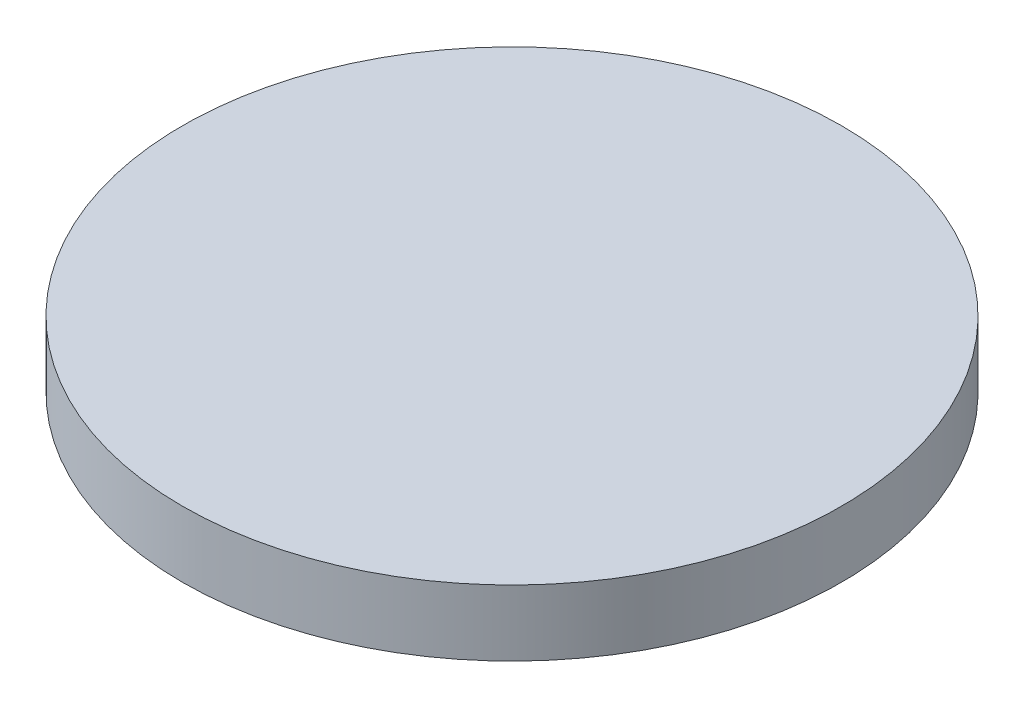
ISO-10303-21;
HEADER;
FILE_DESCRIPTION(('STEP AP214'),'2;1');
FILE_NAME('part.step','',(''),(''),'','','');
FILE_SCHEMA(('AUTOMOTIVE_DESIGN { 1 0 10303 214 1 1 1 1 }'));
ENDSEC;
DATA;
#1=APPLICATION_CONTEXT('core data for automotive mechanical design processes');
#2=APPLICATION_PROTOCOL_DEFINITION('international standard','automotive_design',2000,#1);
#3=PRODUCT_CONTEXT('',#1,'mechanical');
#4=PRODUCT('Part','Part','',(#3));
#5=PRODUCT_RELATED_PRODUCT_CATEGORY('part','',(#4));
#6=PRODUCT_DEFINITION_FORMATION('','',#4);
#7=PRODUCT_DEFINITION_CONTEXT('part definition',#1,'design');
#8=PRODUCT_DEFINITION('design','',#6,#7);
#9=PRODUCT_DEFINITION_SHAPE('','',#8);
#10=(LENGTH_UNIT() NAMED_UNIT(*) SI_UNIT(.MILLI.,.METRE.));
#11=(NAMED_UNIT(*) PLANE_ANGLE_UNIT() SI_UNIT($,.RADIAN.));
#12=(NAMED_UNIT(*) SI_UNIT($,.STERADIAN.) SOLID_ANGLE_UNIT());
#13=UNCERTAINTY_MEASURE_WITH_UNIT(LENGTH_MEASURE(1.E-05),#10,'distance_accuracy_value','');
#14=(GEOMETRIC_REPRESENTATION_CONTEXT(3) GLOBAL_UNCERTAINTY_ASSIGNED_CONTEXT((#13)) GLOBAL_UNIT_ASSIGNED_CONTEXT((#10,
#11,#12)) REPRESENTATION_CONTEXT('',''));
#15=CARTESIAN_POINT('',(0.,0.,0.));
#16=DIRECTION('',(0.,0.,1.));
#17=DIRECTION('',(1.,0.,0.));
#18=AXIS2_PLACEMENT_3D('',#15,#16,#17);
#19=CARTESIAN_POINT('',(0.,4.,0.));
#20=DIRECTION('',(0.,-1.,0.));
#21=DIRECTION('',(0.,0.,-1.));
#22=AXIS2_PLACEMENT_3D('',#19,#20,#21);
#23=CYLINDRICAL_SURFACE('',#22,20.);
#24=CARTESIAN_POINT('',(0.,4.,0.));
#25=DIRECTION('',(0.,1.,0.));
#26=DIRECTION('',(0.,0.,1.));
#27=AXIS2_PLACEMENT_3D('',#24,#25,#26);
#28=CIRCLE('',#27,20.);
#29=CARTESIAN_POINT('',(0.,4.,20.));
#30=VERTEX_POINT('',#29);
#31=EDGE_CURVE('E10',#30,#30,#28,.T.);
#32=ORIENTED_EDGE('',*,*,#31,.F.);
#33=EDGE_LOOP('',(#32));
#34=FACE_BOUND('',#33,.T.);
#35=CARTESIAN_POINT('',(0.,0.,0.));
#36=DIRECTION('',(0.,1.,0.));
#37=DIRECTION('',(0.,0.,1.));
#38=AXIS2_PLACEMENT_3D('',#35,#36,#37);
#39=CIRCLE('',#38,20.);
#40=CARTESIAN_POINT('',(0.,0.,20.));
#41=VERTEX_POINT('',#40);
#42=EDGE_CURVE('E35',#41,#41,#39,.T.);
#43=ORIENTED_EDGE('',*,*,#42,.T.);
#44=EDGE_LOOP('',(#43));
#45=FACE_BOUND('',#44,.T.);
#46=ADVANCED_FACE('F32',(#34,#45),#23,.T.);
#47=CARTESIAN_POINT('',(0.,4.,0.));
#48=DIRECTION('',(0.,1.,0.));
#49=DIRECTION('',(0.,0.,1.));
#50=AXIS2_PLACEMENT_3D('',#47,#48,#49);
#51=PLANE('',#50);
#52=ORIENTED_EDGE('',*,*,#31,.T.);
#53=EDGE_LOOP('',(#52));
#54=FACE_BOUND('',#53,.T.);
#55=ADVANCED_FACE('F61',(#54),#51,.T.);
#56=CARTESIAN_POINT('',(0.,0.,0.));
#57=DIRECTION('',(0.,1.,0.));
#58=DIRECTION('',(0.,0.,1.));
#59=AXIS2_PLACEMENT_3D('',#56,#57,#58);
#60=PLANE('',#59);
#61=CARTESIAN_POINT('',(0.,0.,0.));
#62=DIRECTION('',(0.,-1.,0.));
#63=DIRECTION('',(0.,0.,-1.));
#64=AXIS2_PLACEMENT_3D('',#61,#62,#63);
#65=CIRCLE('',#64,1.);
#66=CARTESIAN_POINT('',(0.,0.,-1.));
#67=VERTEX_POINT('',#66);
#68=EDGE_CURVE('E44',#67,#67,#65,.T.);
#69=ORIENTED_EDGE('',*,*,#68,.F.);
#70=EDGE_LOOP('',(#69));
#71=FACE_BOUND('',#70,.T.);
#72=ORIENTED_EDGE('',*,*,#42,.F.);
#73=EDGE_LOOP('',(#72));
#74=FACE_BOUND('',#73,.T.);
#75=ADVANCED_FACE('F55',(#71,#74),#60,.F.);
#76=CARTESIAN_POINT('',(0.,0.5,0.));
#77=DIRECTION('',(0.,-1.,0.));
#78=DIRECTION('',(0.,0.,-1.));
#79=AXIS2_PLACEMENT_3D('',#76,#77,#78);
#80=CYLINDRICAL_SURFACE('',#79,1.);
#81=CARTESIAN_POINT('',(0.,0.5,0.));
#82=DIRECTION('',(0.,-1.,0.));
#83=DIRECTION('',(0.,0.,-1.));
#84=AXIS2_PLACEMENT_3D('',#81,#82,#83);
#85=CIRCLE('',#84,1.);
#86=CARTESIAN_POINT('',(0.,0.5,-1.));
#87=VERTEX_POINT('',#86);
#88=EDGE_CURVE('E42',#87,#87,#85,.T.);
#89=ORIENTED_EDGE('',*,*,#88,.F.);
#90=EDGE_LOOP('',(#89));
#91=FACE_BOUND('',#90,.T.);
#92=ORIENTED_EDGE('',*,*,#68,.T.);
#93=EDGE_LOOP('',(#92));
#94=FACE_BOUND('',#93,.T.);
#95=ADVANCED_FACE('F52',(#91,#94),#80,.F.);
#96=CARTESIAN_POINT('',(0.,0.5,0.));
#97=DIRECTION('',(0.,-1.,0.));
#98=DIRECTION('',(0.,0.,-1.));
#99=AXIS2_PLACEMENT_3D('',#96,#97,#98);
#100=PLANE('',#99);
#101=ORIENTED_EDGE('',*,*,#88,.T.);
#102=EDGE_LOOP('',(#101));
#103=FACE_BOUND('',#102,.T.);
#104=ADVANCED_FACE('F50',(#103),#100,.T.);
#105=CLOSED_SHELL('',(#46,#55,#75,#95,#104));
#106=MANIFOLD_SOLID_BREP('B2',#105);
#107=ADVANCED_BREP_SHAPE_REPRESENTATION('',(#18,#106),#14);
#108=SHAPE_DEFINITION_REPRESENTATION(#9,#107);
ENDSEC;
END-ISO-10303-21;
